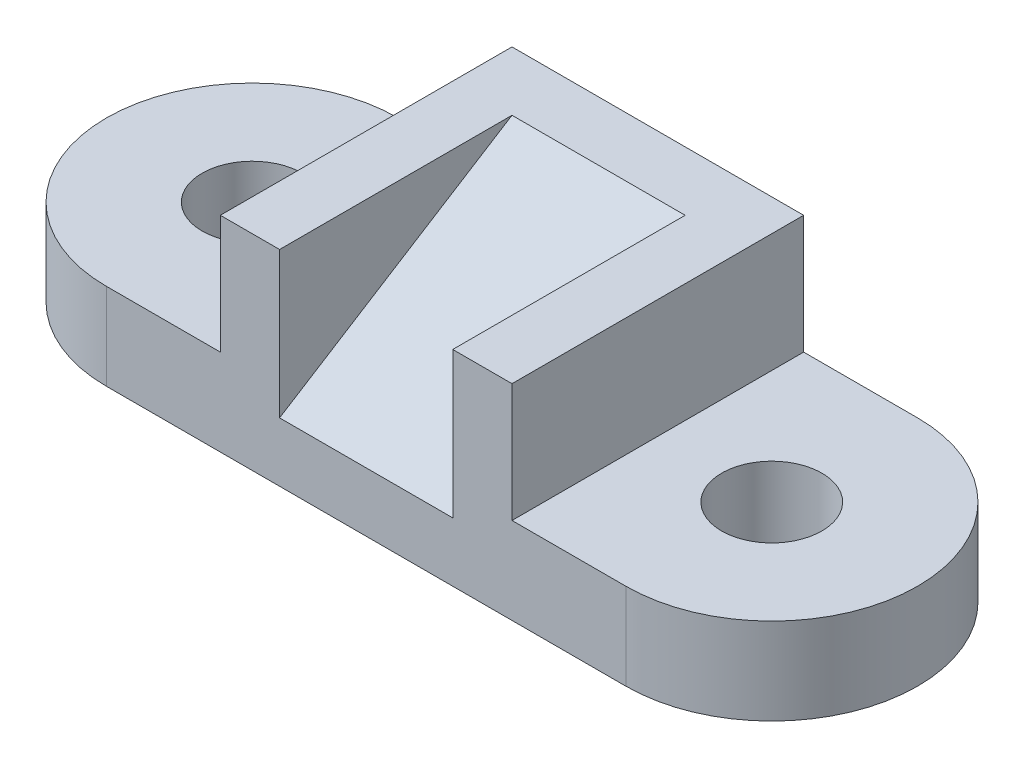
ISO-10303-21;
HEADER;
FILE_DESCRIPTION(('STEP AP214'),'2;1');
FILE_NAME('part.step','',(''),(''),'','','');
FILE_SCHEMA(('AUTOMOTIVE_DESIGN { 1 0 10303 214 1 1 1 1 }'));
ENDSEC;
DATA;
#1=APPLICATION_CONTEXT('core data for automotive mechanical design processes');
#2=APPLICATION_PROTOCOL_DEFINITION('international standard','automotive_design',2000,#1);
#3=PRODUCT_CONTEXT('',#1,'mechanical');
#4=PRODUCT('Part','Part','',(#3));
#5=PRODUCT_RELATED_PRODUCT_CATEGORY('part','',(#4));
#6=PRODUCT_DEFINITION_FORMATION('','',#4);
#7=PRODUCT_DEFINITION_CONTEXT('part definition',#1,'design');
#8=PRODUCT_DEFINITION('design','',#6,#7);
#9=PRODUCT_DEFINITION_SHAPE('','',#8);
#10=(LENGTH_UNIT() NAMED_UNIT(*) SI_UNIT(.MILLI.,.METRE.));
#11=(NAMED_UNIT(*) PLANE_ANGLE_UNIT() SI_UNIT($,.RADIAN.));
#12=(NAMED_UNIT(*) SI_UNIT($,.STERADIAN.) SOLID_ANGLE_UNIT());
#13=UNCERTAINTY_MEASURE_WITH_UNIT(LENGTH_MEASURE(1.E-05),#10,'distance_accuracy_value','');
#14=(GEOMETRIC_REPRESENTATION_CONTEXT(3) GLOBAL_UNCERTAINTY_ASSIGNED_CONTEXT((#13)) GLOBAL_UNIT_ASSIGNED_CONTEXT((#10,
#11,#12)) REPRESENTATION_CONTEXT('',''));
#15=CARTESIAN_POINT('',(0.,0.,0.));
#16=DIRECTION('',(0.,0.,1.));
#17=DIRECTION('',(1.,0.,0.));
#18=AXIS2_PLACEMENT_3D('',#15,#16,#17);
#19=CARTESIAN_POINT('',(51.,63.,-51.));
#20=DIRECTION('',(-1.,0.,0.));
#21=DIRECTION('',(0.,0.,1.));
#22=AXIS2_PLACEMENT_3D('',#19,#20,#21);
#23=PLANE('',#22);
#24=DIRECTION('',(0.,0.,-1.));
#25=VECTOR('',#24,1.);
#26=CARTESIAN_POINT('',(51.,45.,0.));
#27=LINE('',#26,#25);
#28=CARTESIAN_POINT('',(51.,45.,0.));
#29=VERTEX_POINT('',#28);
#30=CARTESIAN_POINT('',(51.,45.,-51.));
#31=VERTEX_POINT('',#30);
#32=EDGE_CURVE('E138',#29,#31,#27,.T.);
#33=ORIENTED_EDGE('',*,*,#32,.T.);
#34=DIRECTION('',(0.,-0.531491071063936,0.847063894508148));
#35=VECTOR('',#34,1.);
#36=CARTESIAN_POINT('',(51.,50.0846896551724,-59.103724137931));
#37=LINE('',#36,#35);
#38=CARTESIAN_POINT('',(51.,13.,0.));
#39=VERTEX_POINT('',#38);
#40=EDGE_CURVE('E137',#31,#39,#37,.T.);
#41=ORIENTED_EDGE('',*,*,#40,.T.);
#42=DIRECTION('',(0.,-1.,0.));
#43=VECTOR('',#42,1.);
#44=CARTESIAN_POINT('',(51.,63.,0.));
#45=LINE('',#44,#43);
#46=EDGE_CURVE('E122',#29,#39,#45,.T.);
#47=ORIENTED_EDGE('',*,*,#46,.F.);
#48=EDGE_LOOP('',(#33,#41,#47));
#49=FACE_BOUND('',#48,.T.);
#50=ADVANCED_FACE('F39',(#49),#23,.T.);
#51=CARTESIAN_POINT('',(13.,63.,0.));
#52=DIRECTION('',(1.,0.,0.));
#53=DIRECTION('',(0.,0.,-1.));
#54=AXIS2_PLACEMENT_3D('',#51,#52,#53);
#55=PLANE('',#54);
#56=DIRECTION('',(0.,-1.,0.));
#57=VECTOR('',#56,1.);
#58=CARTESIAN_POINT('',(13.,63.,0.));
#59=LINE('',#58,#57);
#60=CARTESIAN_POINT('',(13.,45.,0.));
#61=VERTEX_POINT('',#60);
#62=CARTESIAN_POINT('',(13.,13.,0.));
#63=VERTEX_POINT('',#62);
#64=EDGE_CURVE('E134',#61,#63,#59,.T.);
#65=ORIENTED_EDGE('',*,*,#64,.T.);
#66=DIRECTION('',(0.,-0.531491071063936,0.847063894508148));
#67=VECTOR('',#66,1.);
#68=CARTESIAN_POINT('',(13.,13.,0.));
#69=LINE('',#68,#67);
#70=CARTESIAN_POINT('',(13.,45.,-51.));
#71=VERTEX_POINT('',#70);
#72=EDGE_CURVE('E142',#71,#63,#69,.T.);
#73=ORIENTED_EDGE('',*,*,#72,.F.);
#74=DIRECTION('',(0.,0.,1.));
#75=VECTOR('',#74,1.);
#76=CARTESIAN_POINT('',(13.,45.,0.));
#77=LINE('',#76,#75);
#78=EDGE_CURVE('E133',#71,#61,#77,.T.);
#79=ORIENTED_EDGE('',*,*,#78,.T.);
#80=EDGE_LOOP('',(#65,#73,#79));
#81=FACE_BOUND('',#80,.T.);
#82=ADVANCED_FACE('F242',(#81),#55,.T.);
#83=CARTESIAN_POINT('',(0.,45.,0.));
#84=DIRECTION('',(0.,0.,-1.));
#85=DIRECTION('',(-1.,0.,0.));
#86=AXIS2_PLACEMENT_3D('',#83,#84,#85);
#87=PLANE('',#86);
#88=ORIENTED_EDGE('',*,*,#46,.T.);
#89=DIRECTION('',(1.,0.,0.));
#90=VECTOR('',#89,1.);
#91=CARTESIAN_POINT('',(13.,13.,0.));
#92=LINE('',#91,#90);
#93=EDGE_CURVE('E127',#63,#39,#92,.T.);
#94=ORIENTED_EDGE('',*,*,#93,.F.);
#95=ORIENTED_EDGE('',*,*,#64,.F.);
#96=DIRECTION('',(1.,0.,0.));
#97=VECTOR('',#96,1.);
#98=CARTESIAN_POINT('',(0.,45.,0.));
#99=LINE('',#98,#97);
#100=CARTESIAN_POINT('',(0.,45.,0.));
#101=VERTEX_POINT('',#100);
#102=EDGE_CURVE('E207',#101,#61,#99,.T.);
#103=ORIENTED_EDGE('',*,*,#102,.F.);
#104=DIRECTION('',(0.,-1.,0.));
#105=VECTOR('',#104,1.);
#106=CARTESIAN_POINT('',(0.,45.,0.));
#107=LINE('',#106,#105);
#108=CARTESIAN_POINT('',(0.,19.,0.));
#109=VERTEX_POINT('',#108);
#110=EDGE_CURVE('E11',#101,#109,#107,.T.);
#111=ORIENTED_EDGE('',*,*,#110,.T.);
#112=DIRECTION('',(1.,0.,0.));
#113=VECTOR('',#112,1.);
#114=CARTESIAN_POINT('',(-25.,19.,0.));
#115=LINE('',#114,#113);
#116=CARTESIAN_POINT('',(-25.,19.,0.));
#117=VERTEX_POINT('',#116);
#118=EDGE_CURVE('E188',#117,#109,#115,.T.);
#119=ORIENTED_EDGE('',*,*,#118,.F.);
#120=DIRECTION('',(0.,-1.,0.));
#121=VECTOR('',#120,1.);
#122=CARTESIAN_POINT('',(-25.,19.,0.));
#123=LINE('',#122,#121);
#124=CARTESIAN_POINT('',(-25.,0.,0.));
#125=VERTEX_POINT('',#124);
#126=EDGE_CURVE('E199',#117,#125,#123,.T.);
#127=ORIENTED_EDGE('',*,*,#126,.T.);
#128=DIRECTION('',(1.,0.,0.));
#129=VECTOR('',#128,1.);
#130=CARTESIAN_POINT('',(0.,0.,0.));
#131=LINE('',#130,#129);
#132=CARTESIAN_POINT('',(89.,0.,0.));
#133=VERTEX_POINT('',#132);
#134=EDGE_CURVE('E202',#125,#133,#131,.T.);
#135=ORIENTED_EDGE('',*,*,#134,.T.);
#136=DIRECTION('',(0.,-1.,0.));
#137=VECTOR('',#136,1.);
#138=CARTESIAN_POINT('',(89.,19.,0.));
#139=LINE('',#138,#137);
#140=CARTESIAN_POINT('',(89.,19.,0.));
#141=VERTEX_POINT('',#140);
#142=EDGE_CURVE('E157',#141,#133,#139,.T.);
#143=ORIENTED_EDGE('',*,*,#142,.F.);
#144=DIRECTION('',(1.,0.,0.));
#145=VECTOR('',#144,1.);
#146=CARTESIAN_POINT('',(89.,19.,0.));
#147=LINE('',#146,#145);
#148=CARTESIAN_POINT('',(64.,19.,0.));
#149=VERTEX_POINT('',#148);
#150=EDGE_CURVE('E160',#149,#141,#147,.T.);
#151=ORIENTED_EDGE('',*,*,#150,.F.);
#152=DIRECTION('',(0.,-1.,0.));
#153=VECTOR('',#152,1.);
#154=CARTESIAN_POINT('',(64.,45.,0.));
#155=LINE('',#154,#153);
#156=CARTESIAN_POINT('',(64.,45.,0.));
#157=VERTEX_POINT('',#156);
#158=EDGE_CURVE('E47',#157,#149,#155,.T.);
#159=ORIENTED_EDGE('',*,*,#158,.F.);
#160=EDGE_CURVE('E130',#29,#157,#99,.T.);
#161=ORIENTED_EDGE('',*,*,#160,.F.);
#162=EDGE_LOOP('',(#88,#94,#95,#103,#111,#119,#127,#135,#143,#151,#159,#161));
#163=FACE_BOUND('',#162,.T.);
#164=ADVANCED_FACE('F124',(#163),#87,.F.);
#165=CARTESIAN_POINT('',(0.,45.,0.));
#166=DIRECTION('',(0.,-1.,0.));
#167=DIRECTION('',(0.,0.,-1.));
#168=AXIS2_PLACEMENT_3D('',#165,#166,#167);
#169=PLANE('',#168);
#170=ORIENTED_EDGE('',*,*,#32,.F.);
#171=ORIENTED_EDGE('',*,*,#160,.T.);
#172=DIRECTION('',(0.,0.,-1.));
#173=VECTOR('',#172,1.);
#174=CARTESIAN_POINT('',(64.,45.,0.));
#175=LINE('',#174,#173);
#176=CARTESIAN_POINT('',(64.,45.,-64.));
#177=VERTEX_POINT('',#176);
#178=EDGE_CURVE('E210',#157,#177,#175,.T.);
#179=ORIENTED_EDGE('',*,*,#178,.T.);
#180=DIRECTION('',(-1.,0.,0.));
#181=VECTOR('',#180,1.);
#182=CARTESIAN_POINT('',(0.,45.,-64.));
#183=LINE('',#182,#181);
#184=CARTESIAN_POINT('',(0.,45.,-64.));
#185=VERTEX_POINT('',#184);
#186=EDGE_CURVE('E212',#177,#185,#183,.T.);
#187=ORIENTED_EDGE('',*,*,#186,.T.);
#188=DIRECTION('',(0.,0.,1.));
#189=VECTOR('',#188,1.);
#190=CARTESIAN_POINT('',(0.,45.,0.));
#191=LINE('',#190,#189);
#192=EDGE_CURVE('E203',#185,#101,#191,.T.);
#193=ORIENTED_EDGE('',*,*,#192,.T.);
#194=ORIENTED_EDGE('',*,*,#102,.T.);
#195=ORIENTED_EDGE('',*,*,#78,.F.);
#196=DIRECTION('',(-1.,0.,0.));
#197=VECTOR('',#196,1.);
#198=CARTESIAN_POINT('',(0.,45.,-51.));
#199=LINE('',#198,#197);
#200=EDGE_CURVE('E151',#31,#71,#199,.T.);
#201=ORIENTED_EDGE('',*,*,#200,.F.);
#202=EDGE_LOOP('',(#170,#171,#179,#187,#193,#194,#195,#201));
#203=FACE_BOUND('',#202,.T.);
#204=ADVANCED_FACE('F239',(#203),#169,.F.);
#205=CARTESIAN_POINT('',(0.,0.,0.));
#206=DIRECTION('',(0.,-1.,0.));
#207=DIRECTION('',(0.,0.,-1.));
#208=AXIS2_PLACEMENT_3D('',#205,#206,#207);
#209=PLANE('',#208);
#210=CARTESIAN_POINT('',(-25.,0.,-32.));
#211=DIRECTION('',(0.,1.,0.));
#212=DIRECTION('',(0.,0.,1.));
#213=AXIS2_PLACEMENT_3D('',#210,#211,#212);
#214=CIRCLE('',#213,11.);
#215=CARTESIAN_POINT('',(-25.,0.,-21.));
#216=VERTEX_POINT('',#215);
#217=EDGE_CURVE('E176',#216,#216,#214,.T.);
#218=ORIENTED_EDGE('',*,*,#217,.T.);
#219=EDGE_LOOP('',(#218));
#220=FACE_BOUND('',#219,.T.);
#221=CARTESIAN_POINT('',(89.,0.,-32.));
#222=DIRECTION('',(0.,1.,0.));
#223=DIRECTION('',(0.,0.,1.));
#224=AXIS2_PLACEMENT_3D('',#221,#222,#223);
#225=CIRCLE('',#224,11.);
#226=CARTESIAN_POINT('',(89.,0.,-21.));
#227=VERTEX_POINT('',#226);
#228=EDGE_CURVE('E173',#227,#227,#225,.T.);
#229=ORIENTED_EDGE('',*,*,#228,.T.);
#230=EDGE_LOOP('',(#229));
#231=FACE_BOUND('',#230,.T.);
#232=CARTESIAN_POINT('',(89.,0.,-32.));
#233=DIRECTION('',(0.,1.,0.));
#234=DIRECTION('',(0.,0.,1.));
#235=AXIS2_PLACEMENT_3D('',#232,#233,#234);
#236=CIRCLE('',#235,32.);
#237=CARTESIAN_POINT('',(89.,0.,-64.));
#238=VERTEX_POINT('',#237);
#239=EDGE_CURVE('E161',#133,#238,#236,.T.);
#240=ORIENTED_EDGE('',*,*,#239,.F.);
#241=ORIENTED_EDGE('',*,*,#134,.F.);
#242=CARTESIAN_POINT('',(-25.,0.,-32.));
#243=DIRECTION('',(0.,1.,0.));
#244=DIRECTION('',(0.,0.,1.));
#245=AXIS2_PLACEMENT_3D('',#242,#243,#244);
#246=CIRCLE('',#245,32.);
#247=CARTESIAN_POINT('',(-25.,0.,-64.));
#248=VERTEX_POINT('',#247);
#249=EDGE_CURVE('E182',#248,#125,#246,.T.);
#250=ORIENTED_EDGE('',*,*,#249,.F.);
#251=DIRECTION('',(-1.,0.,0.));
#252=VECTOR('',#251,1.);
#253=CARTESIAN_POINT('',(0.,0.,-64.));
#254=LINE('',#253,#252);
#255=EDGE_CURVE('E206',#238,#248,#254,.T.);
#256=ORIENTED_EDGE('',*,*,#255,.F.);
#257=EDGE_LOOP('',(#240,#241,#250,#256));
#258=FACE_BOUND('',#257,.T.);
#259=ADVANCED_FACE('F252',(#220,#231,#258),#209,.T.);
#260=CARTESIAN_POINT('',(64.,45.,0.));
#261=DIRECTION('',(-1.,0.,0.));
#262=DIRECTION('',(0.,0.,1.));
#263=AXIS2_PLACEMENT_3D('',#260,#261,#262);
#264=PLANE('',#263);
#265=DIRECTION('',(0.,0.,1.));
#266=VECTOR('',#265,1.);
#267=CARTESIAN_POINT('',(64.,19.,-64.));
#268=LINE('',#267,#266);
#269=CARTESIAN_POINT('',(64.,19.,-64.));
#270=VERTEX_POINT('',#269);
#271=EDGE_CURVE('E54',#270,#149,#268,.T.);
#272=ORIENTED_EDGE('',*,*,#271,.F.);
#273=DIRECTION('',(0.,-1.,0.));
#274=VECTOR('',#273,1.);
#275=CARTESIAN_POINT('',(64.,45.,-64.));
#276=LINE('',#275,#274);
#277=EDGE_CURVE('E218',#177,#270,#276,.T.);
#278=ORIENTED_EDGE('',*,*,#277,.F.);
#279=ORIENTED_EDGE('',*,*,#178,.F.);
#280=ORIENTED_EDGE('',*,*,#158,.T.);
#281=EDGE_LOOP('',(#272,#278,#279,#280));
#282=FACE_BOUND('',#281,.T.);
#283=ADVANCED_FACE('F220',(#282),#264,.F.);
#284=CARTESIAN_POINT('',(0.,45.,0.));
#285=DIRECTION('',(1.,0.,0.));
#286=DIRECTION('',(0.,0.,-1.));
#287=AXIS2_PLACEMENT_3D('',#284,#285,#286);
#288=PLANE('',#287);
#289=DIRECTION('',(0.,0.,-1.));
#290=VECTOR('',#289,1.);
#291=CARTESIAN_POINT('',(0.,19.,-64.));
#292=LINE('',#291,#290);
#293=CARTESIAN_POINT('',(0.,19.,-64.));
#294=VERTEX_POINT('',#293);
#295=EDGE_CURVE('E62',#109,#294,#292,.T.);
#296=ORIENTED_EDGE('',*,*,#295,.F.);
#297=ORIENTED_EDGE('',*,*,#110,.F.);
#298=ORIENTED_EDGE('',*,*,#192,.F.);
#299=DIRECTION('',(0.,-1.,0.));
#300=VECTOR('',#299,1.);
#301=CARTESIAN_POINT('',(0.,45.,-64.));
#302=LINE('',#301,#300);
#303=EDGE_CURVE('E214',#185,#294,#302,.T.);
#304=ORIENTED_EDGE('',*,*,#303,.T.);
#305=EDGE_LOOP('',(#296,#297,#298,#304));
#306=FACE_BOUND('',#305,.T.);
#307=ADVANCED_FACE('F41',(#306),#288,.F.);
#308=CARTESIAN_POINT('',(0.,45.,-64.));
#309=DIRECTION('',(0.,0.,1.));
#310=DIRECTION('',(1.,0.,0.));
#311=AXIS2_PLACEMENT_3D('',#308,#309,#310);
#312=PLANE('',#311);
#313=ORIENTED_EDGE('',*,*,#255,.T.);
#314=DIRECTION('',(0.,-1.,0.));
#315=VECTOR('',#314,1.);
#316=CARTESIAN_POINT('',(-25.,19.,-64.));
#317=LINE('',#316,#315);
#318=CARTESIAN_POINT('',(-25.,19.,-64.));
#319=VERTEX_POINT('',#318);
#320=EDGE_CURVE('E194',#319,#248,#317,.T.);
#321=ORIENTED_EDGE('',*,*,#320,.F.);
#322=DIRECTION('',(-1.,0.,0.));
#323=VECTOR('',#322,1.);
#324=CARTESIAN_POINT('',(-25.,19.,-64.));
#325=LINE('',#324,#323);
#326=EDGE_CURVE('E192',#294,#319,#325,.T.);
#327=ORIENTED_EDGE('',*,*,#326,.F.);
#328=ORIENTED_EDGE('',*,*,#303,.F.);
#329=ORIENTED_EDGE('',*,*,#186,.F.);
#330=ORIENTED_EDGE('',*,*,#277,.T.);
#331=DIRECTION('',(-1.,0.,0.));
#332=VECTOR('',#331,1.);
#333=CARTESIAN_POINT('',(89.,19.,-64.));
#334=LINE('',#333,#332);
#335=CARTESIAN_POINT('',(89.,19.,-64.));
#336=VERTEX_POINT('',#335);
#337=EDGE_CURVE('E168',#336,#270,#334,.T.);
#338=ORIENTED_EDGE('',*,*,#337,.F.);
#339=DIRECTION('',(0.,-1.,0.));
#340=VECTOR('',#339,1.);
#341=CARTESIAN_POINT('',(89.,19.,-64.));
#342=LINE('',#341,#340);
#343=EDGE_CURVE('E154',#336,#238,#342,.T.);
#344=ORIENTED_EDGE('',*,*,#343,.T.);
#345=EDGE_LOOP('',(#313,#321,#327,#328,#329,#330,#338,#344));
#346=FACE_BOUND('',#345,.T.);
#347=ADVANCED_FACE('F232',(#346),#312,.F.);
#348=CARTESIAN_POINT('',(-25.,19.,-32.));
#349=DIRECTION('',(0.,1.,0.));
#350=DIRECTION('',(0.,0.,1.));
#351=AXIS2_PLACEMENT_3D('',#348,#349,#350);
#352=PLANE('',#351);
#353=CARTESIAN_POINT('',(-25.,19.,-32.));
#354=DIRECTION('',(0.,1.,0.));
#355=DIRECTION('',(0.,0.,1.));
#356=AXIS2_PLACEMENT_3D('',#353,#354,#355);
#357=CIRCLE('',#356,32.);
#358=EDGE_CURVE('E185',#319,#117,#357,.T.);
#359=ORIENTED_EDGE('',*,*,#358,.T.);
#360=ORIENTED_EDGE('',*,*,#118,.T.);
#361=ORIENTED_EDGE('',*,*,#295,.T.);
#362=ORIENTED_EDGE('',*,*,#326,.T.);
#363=EDGE_LOOP('',(#359,#360,#361,#362));
#364=FACE_BOUND('',#363,.T.);
#365=CARTESIAN_POINT('',(-25.,19.,-32.));
#366=DIRECTION('',(0.,1.,0.));
#367=DIRECTION('',(0.,0.,1.));
#368=AXIS2_PLACEMENT_3D('',#365,#366,#367);
#369=CIRCLE('',#368,11.);
#370=CARTESIAN_POINT('',(-25.,19.,-21.));
#371=VERTEX_POINT('',#370);
#372=EDGE_CURVE('E179',#371,#371,#369,.T.);
#373=ORIENTED_EDGE('',*,*,#372,.F.);
#374=EDGE_LOOP('',(#373));
#375=FACE_BOUND('',#374,.T.);
#376=ADVANCED_FACE('F244',(#364,#375),#352,.T.);
#377=CARTESIAN_POINT('',(-25.,19.,-32.));
#378=DIRECTION('',(0.,-1.,0.));
#379=DIRECTION('',(0.,0.,-1.));
#380=AXIS2_PLACEMENT_3D('',#377,#378,#379);
#381=CYLINDRICAL_SURFACE('',#380,32.);
#382=ORIENTED_EDGE('',*,*,#249,.T.);
#383=ORIENTED_EDGE('',*,*,#126,.F.);
#384=ORIENTED_EDGE('',*,*,#358,.F.);
#385=ORIENTED_EDGE('',*,*,#320,.T.);
#386=EDGE_LOOP('',(#382,#383,#384,#385));
#387=FACE_BOUND('',#386,.T.);
#388=ADVANCED_FACE('F249',(#387),#381,.T.);
#389=CARTESIAN_POINT('',(-25.,19.,-32.));
#390=DIRECTION('',(0.,-1.,0.));
#391=DIRECTION('',(0.,0.,-1.));
#392=AXIS2_PLACEMENT_3D('',#389,#390,#391);
#393=CYLINDRICAL_SURFACE('',#392,11.);
#394=ORIENTED_EDGE('',*,*,#372,.T.);
#395=EDGE_LOOP('',(#394));
#396=FACE_BOUND('',#395,.T.);
#397=ORIENTED_EDGE('',*,*,#217,.F.);
#398=EDGE_LOOP('',(#397));
#399=FACE_BOUND('',#398,.T.);
#400=ADVANCED_FACE('F277',(#396,#399),#393,.F.);
#401=CARTESIAN_POINT('',(89.,19.,-32.));
#402=DIRECTION('',(0.,1.,0.));
#403=DIRECTION('',(0.,0.,1.));
#404=AXIS2_PLACEMENT_3D('',#401,#402,#403);
#405=PLANE('',#404);
#406=CARTESIAN_POINT('',(89.,19.,-32.));
#407=DIRECTION('',(0.,1.,0.));
#408=DIRECTION('',(0.,0.,1.));
#409=AXIS2_PLACEMENT_3D('',#406,#407,#408);
#410=CIRCLE('',#409,32.);
#411=EDGE_CURVE('E165',#141,#336,#410,.T.);
#412=ORIENTED_EDGE('',*,*,#411,.T.);
#413=ORIENTED_EDGE('',*,*,#337,.T.);
#414=ORIENTED_EDGE('',*,*,#271,.T.);
#415=ORIENTED_EDGE('',*,*,#150,.T.);
#416=EDGE_LOOP('',(#412,#413,#414,#415));
#417=FACE_BOUND('',#416,.T.);
#418=CARTESIAN_POINT('',(89.,19.,-32.));
#419=DIRECTION('',(0.,1.,0.));
#420=DIRECTION('',(0.,0.,1.));
#421=AXIS2_PLACEMENT_3D('',#418,#419,#420);
#422=CIRCLE('',#421,11.);
#423=CARTESIAN_POINT('',(89.,19.,-21.));
#424=VERTEX_POINT('',#423);
#425=EDGE_CURVE('E164',#424,#424,#422,.T.);
#426=ORIENTED_EDGE('',*,*,#425,.F.);
#427=EDGE_LOOP('',(#426));
#428=FACE_BOUND('',#427,.T.);
#429=ADVANCED_FACE('F223',(#417,#428),#405,.T.);
#430=CARTESIAN_POINT('',(89.,19.,-32.));
#431=DIRECTION('',(0.,-1.,0.));
#432=DIRECTION('',(0.,0.,-1.));
#433=AXIS2_PLACEMENT_3D('',#430,#431,#432);
#434=CYLINDRICAL_SURFACE('',#433,32.);
#435=ORIENTED_EDGE('',*,*,#239,.T.);
#436=ORIENTED_EDGE('',*,*,#343,.F.);
#437=ORIENTED_EDGE('',*,*,#411,.F.);
#438=ORIENTED_EDGE('',*,*,#142,.T.);
#439=EDGE_LOOP('',(#435,#436,#437,#438));
#440=FACE_BOUND('',#439,.T.);
#441=ADVANCED_FACE('F230',(#440),#434,.T.);
#442=CARTESIAN_POINT('',(89.,19.,-32.));
#443=DIRECTION('',(0.,-1.,0.));
#444=DIRECTION('',(0.,0.,-1.));
#445=AXIS2_PLACEMENT_3D('',#442,#443,#444);
#446=CYLINDRICAL_SURFACE('',#445,11.);
#447=ORIENTED_EDGE('',*,*,#425,.T.);
#448=EDGE_LOOP('',(#447));
#449=FACE_BOUND('',#448,.T.);
#450=ORIENTED_EDGE('',*,*,#228,.F.);
#451=EDGE_LOOP('',(#450));
#452=FACE_BOUND('',#451,.T.);
#453=ADVANCED_FACE('F274',(#449,#452),#446,.F.);
#454=CARTESIAN_POINT('',(60.,13.,0.));
#455=DIRECTION('',(0.,-0.847063894508148,-0.531491071063936));
#456=DIRECTION('',(0.,0.531491071063936,-0.847063894508148));
#457=AXIS2_PLACEMENT_3D('',#454,#455,#456);
#458=PLANE('',#457);
#459=ORIENTED_EDGE('',*,*,#40,.F.);
#460=ORIENTED_EDGE('',*,*,#200,.T.);
#461=ORIENTED_EDGE('',*,*,#72,.T.);
#462=ORIENTED_EDGE('',*,*,#93,.T.);
#463=EDGE_LOOP('',(#459,#460,#461,#462));
#464=FACE_BOUND('',#463,.T.);
#465=ADVANCED_FACE('F145',(#464),#458,.F.);
#466=CLOSED_SHELL('',(#50,#82,#164,#204,#259,#283,#307,#347,#376,#388,#400,#429,#441,#453,#465));
#467=MANIFOLD_SOLID_BREP('B2',#466);
#468=ADVANCED_BREP_SHAPE_REPRESENTATION('',(#18,#467),#14);
#469=SHAPE_DEFINITION_REPRESENTATION(#9,#468);
ENDSEC;
END-ISO-10303-21;
